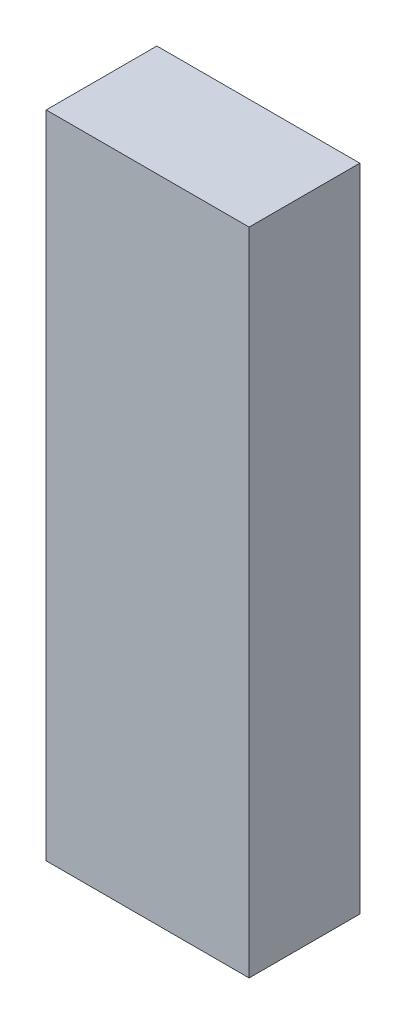
ISO-10303-21;
HEADER;
FILE_DESCRIPTION(('STEP AP214'),'2;1');
FILE_NAME('part.step','',(''),(''),'','','');
FILE_SCHEMA(('AUTOMOTIVE_DESIGN { 1 0 10303 214 1 1 1 1 }'));
ENDSEC;
DATA;
#1=APPLICATION_CONTEXT('core data for automotive mechanical design processes');
#2=APPLICATION_PROTOCOL_DEFINITION('international standard','automotive_design',2000,#1);
#3=PRODUCT_CONTEXT('',#1,'mechanical');
#4=PRODUCT('Part','Part','',(#3));
#5=PRODUCT_RELATED_PRODUCT_CATEGORY('part','',(#4));
#6=PRODUCT_DEFINITION_FORMATION('','',#4);
#7=PRODUCT_DEFINITION_CONTEXT('part definition',#1,'design');
#8=PRODUCT_DEFINITION('design','',#6,#7);
#9=PRODUCT_DEFINITION_SHAPE('','',#8);
#10=(LENGTH_UNIT() NAMED_UNIT(*) SI_UNIT(.MILLI.,.METRE.));
#11=(NAMED_UNIT(*) PLANE_ANGLE_UNIT() SI_UNIT($,.RADIAN.));
#12=(NAMED_UNIT(*) SI_UNIT($,.STERADIAN.) SOLID_ANGLE_UNIT());
#13=UNCERTAINTY_MEASURE_WITH_UNIT(LENGTH_MEASURE(1.E-05),#10,'distance_accuracy_value','');
#14=(GEOMETRIC_REPRESENTATION_CONTEXT(3) GLOBAL_UNCERTAINTY_ASSIGNED_CONTEXT((#13)) GLOBAL_UNIT_ASSIGNED_CONTEXT((#10,
#11,#12)) REPRESENTATION_CONTEXT('',''));
#15=CARTESIAN_POINT('',(0.,0.,0.));
#16=DIRECTION('',(0.,0.,1.));
#17=DIRECTION('',(1.,0.,0.));
#18=AXIS2_PLACEMENT_3D('',#15,#16,#17);
#19=CARTESIAN_POINT('',(0.,0.,24.));
#20=DIRECTION('',(0.,0.,1.));
#21=DIRECTION('',(1.,0.,0.));
#22=AXIS2_PLACEMENT_3D('',#19,#20,#21);
#23=PLANE('',#22);
#24=DIRECTION('',(0.,-1.,0.));
#25=VECTOR('',#24,1.);
#26=CARTESIAN_POINT('',(-22.,70.5,24.));
#27=LINE('',#26,#25);
#28=CARTESIAN_POINT('',(-22.,70.5,24.));
#29=VERTEX_POINT('',#28);
#30=CARTESIAN_POINT('',(-22.,-70.5,24.));
#31=VERTEX_POINT('',#30);
#32=EDGE_CURVE('E79',#29,#31,#27,.T.);
#33=ORIENTED_EDGE('',*,*,#32,.T.);
#34=DIRECTION('',(1.,0.,0.));
#35=VECTOR('',#34,1.);
#36=CARTESIAN_POINT('',(-22.,-70.5,24.));
#37=LINE('',#36,#35);
#38=CARTESIAN_POINT('',(22.,-70.5,24.));
#39=VERTEX_POINT('',#38);
#40=EDGE_CURVE('E101',#31,#39,#37,.T.);
#41=ORIENTED_EDGE('',*,*,#40,.T.);
#42=DIRECTION('',(0.,1.,0.));
#43=VECTOR('',#42,1.);
#44=CARTESIAN_POINT('',(22.,-70.5,24.));
#45=LINE('',#44,#43);
#46=CARTESIAN_POINT('',(22.,70.5,24.));
#47=VERTEX_POINT('',#46);
#48=EDGE_CURVE('E72',#39,#47,#45,.T.);
#49=ORIENTED_EDGE('',*,*,#48,.T.);
#50=DIRECTION('',(-1.,0.,0.));
#51=VECTOR('',#50,1.);
#52=CARTESIAN_POINT('',(22.,70.5,24.));
#53=LINE('',#52,#51);
#54=EDGE_CURVE('E10',#47,#29,#53,.T.);
#55=ORIENTED_EDGE('',*,*,#54,.T.);
#56=EDGE_LOOP('',(#33,#41,#49,#55));
#57=FACE_BOUND('',#56,.T.);
#58=ADVANCED_FACE('F15',(#57),#23,.T.);
#59=CARTESIAN_POINT('',(0.,0.,0.));
#60=DIRECTION('',(0.,0.,1.));
#61=DIRECTION('',(1.,0.,0.));
#62=AXIS2_PLACEMENT_3D('',#59,#60,#61);
#63=PLANE('',#62);
#64=DIRECTION('',(-1.,0.,0.));
#65=VECTOR('',#64,1.);
#66=CARTESIAN_POINT('',(22.,70.5,0.));
#67=LINE('',#66,#65);
#68=CARTESIAN_POINT('',(22.,70.5,0.));
#69=VERTEX_POINT('',#68);
#70=CARTESIAN_POINT('',(-22.,70.5,0.));
#71=VERTEX_POINT('',#70);
#72=EDGE_CURVE('E23',#69,#71,#67,.T.);
#73=ORIENTED_EDGE('',*,*,#72,.F.);
#74=DIRECTION('',(0.,1.,0.));
#75=VECTOR('',#74,1.);
#76=CARTESIAN_POINT('',(22.,-70.5,0.));
#77=LINE('',#76,#75);
#78=CARTESIAN_POINT('',(22.,-70.5,0.));
#79=VERTEX_POINT('',#78);
#80=EDGE_CURVE('E107',#79,#69,#77,.T.);
#81=ORIENTED_EDGE('',*,*,#80,.F.);
#82=DIRECTION('',(1.,0.,0.));
#83=VECTOR('',#82,1.);
#84=CARTESIAN_POINT('',(-22.,-70.5,0.));
#85=LINE('',#84,#83);
#86=CARTESIAN_POINT('',(-22.,-70.5,0.));
#87=VERTEX_POINT('',#86);
#88=EDGE_CURVE('E81',#87,#79,#85,.T.);
#89=ORIENTED_EDGE('',*,*,#88,.F.);
#90=DIRECTION('',(0.,-1.,0.));
#91=VECTOR('',#90,1.);
#92=CARTESIAN_POINT('',(-22.,70.5,0.));
#93=LINE('',#92,#91);
#94=EDGE_CURVE('E77',#71,#87,#93,.T.);
#95=ORIENTED_EDGE('',*,*,#94,.F.);
#96=EDGE_LOOP('',(#73,#81,#89,#95));
#97=FACE_BOUND('',#96,.T.);
#98=ADVANCED_FACE('F83',(#97),#63,.F.);
#99=CARTESIAN_POINT('',(22.,70.5,0.));
#100=DIRECTION('',(0.,-1.,0.));
#101=DIRECTION('',(0.,0.,-1.));
#102=AXIS2_PLACEMENT_3D('',#99,#100,#101);
#103=PLANE('',#102);
#104=ORIENTED_EDGE('',*,*,#72,.T.);
#105=DIRECTION('',(0.,0.,1.));
#106=VECTOR('',#105,1.);
#107=CARTESIAN_POINT('',(-22.,70.5,0.));
#108=LINE('',#107,#106);
#109=EDGE_CURVE('E66',#71,#29,#108,.T.);
#110=ORIENTED_EDGE('',*,*,#109,.T.);
#111=ORIENTED_EDGE('',*,*,#54,.F.);
#112=DIRECTION('',(0.,0.,1.));
#113=VECTOR('',#112,1.);
#114=CARTESIAN_POINT('',(22.,70.5,0.));
#115=LINE('',#114,#113);
#116=EDGE_CURVE('E69',#69,#47,#115,.T.);
#117=ORIENTED_EDGE('',*,*,#116,.F.);
#118=EDGE_LOOP('',(#104,#110,#111,#117));
#119=FACE_BOUND('',#118,.T.);
#120=ADVANCED_FACE('F65',(#119),#103,.F.);
#121=CARTESIAN_POINT('',(22.,-70.5,0.));
#122=DIRECTION('',(-1.,0.,0.));
#123=DIRECTION('',(0.,0.,1.));
#124=AXIS2_PLACEMENT_3D('',#121,#122,#123);
#125=PLANE('',#124);
#126=ORIENTED_EDGE('',*,*,#80,.T.);
#127=ORIENTED_EDGE('',*,*,#116,.T.);
#128=ORIENTED_EDGE('',*,*,#48,.F.);
#129=DIRECTION('',(0.,0.,1.));
#130=VECTOR('',#129,1.);
#131=CARTESIAN_POINT('',(22.,-70.5,0.));
#132=LINE('',#131,#130);
#133=EDGE_CURVE('E97',#79,#39,#132,.T.);
#134=ORIENTED_EDGE('',*,*,#133,.F.);
#135=EDGE_LOOP('',(#126,#127,#128,#134));
#136=FACE_BOUND('',#135,.T.);
#137=ADVANCED_FACE('F113',(#136),#125,.F.);
#138=CARTESIAN_POINT('',(-22.,-70.5,0.));
#139=DIRECTION('',(0.,1.,0.));
#140=DIRECTION('',(1.,0.,0.));
#141=AXIS2_PLACEMENT_3D('',#138,#139,#140);
#142=PLANE('',#141);
#143=ORIENTED_EDGE('',*,*,#88,.T.);
#144=ORIENTED_EDGE('',*,*,#133,.T.);
#145=ORIENTED_EDGE('',*,*,#40,.F.);
#146=DIRECTION('',(0.,0.,1.));
#147=VECTOR('',#146,1.);
#148=CARTESIAN_POINT('',(-22.,-70.5,0.));
#149=LINE('',#148,#147);
#150=EDGE_CURVE('E87',#87,#31,#149,.T.);
#151=ORIENTED_EDGE('',*,*,#150,.F.);
#152=EDGE_LOOP('',(#143,#144,#145,#151));
#153=FACE_BOUND('',#152,.T.);
#154=ADVANCED_FACE('F116',(#153),#142,.F.);
#155=CARTESIAN_POINT('',(-22.,70.5,0.));
#156=DIRECTION('',(1.,0.,0.));
#157=DIRECTION('',(0.,1.,0.));
#158=AXIS2_PLACEMENT_3D('',#155,#156,#157);
#159=PLANE('',#158);
#160=ORIENTED_EDGE('',*,*,#94,.T.);
#161=ORIENTED_EDGE('',*,*,#150,.T.);
#162=ORIENTED_EDGE('',*,*,#32,.F.);
#163=ORIENTED_EDGE('',*,*,#109,.F.);
#164=EDGE_LOOP('',(#160,#161,#162,#163));
#165=FACE_BOUND('',#164,.T.);
#166=ADVANCED_FACE('F75',(#165),#159,.F.);
#167=CLOSED_SHELL('',(#58,#98,#120,#137,#154,#166));
#168=MANIFOLD_SOLID_BREP('B1',#167);
#169=ADVANCED_BREP_SHAPE_REPRESENTATION('',(#18,#168),#14);
#170=SHAPE_DEFINITION_REPRESENTATION(#9,#169);
ENDSEC;
END-ISO-10303-21;
